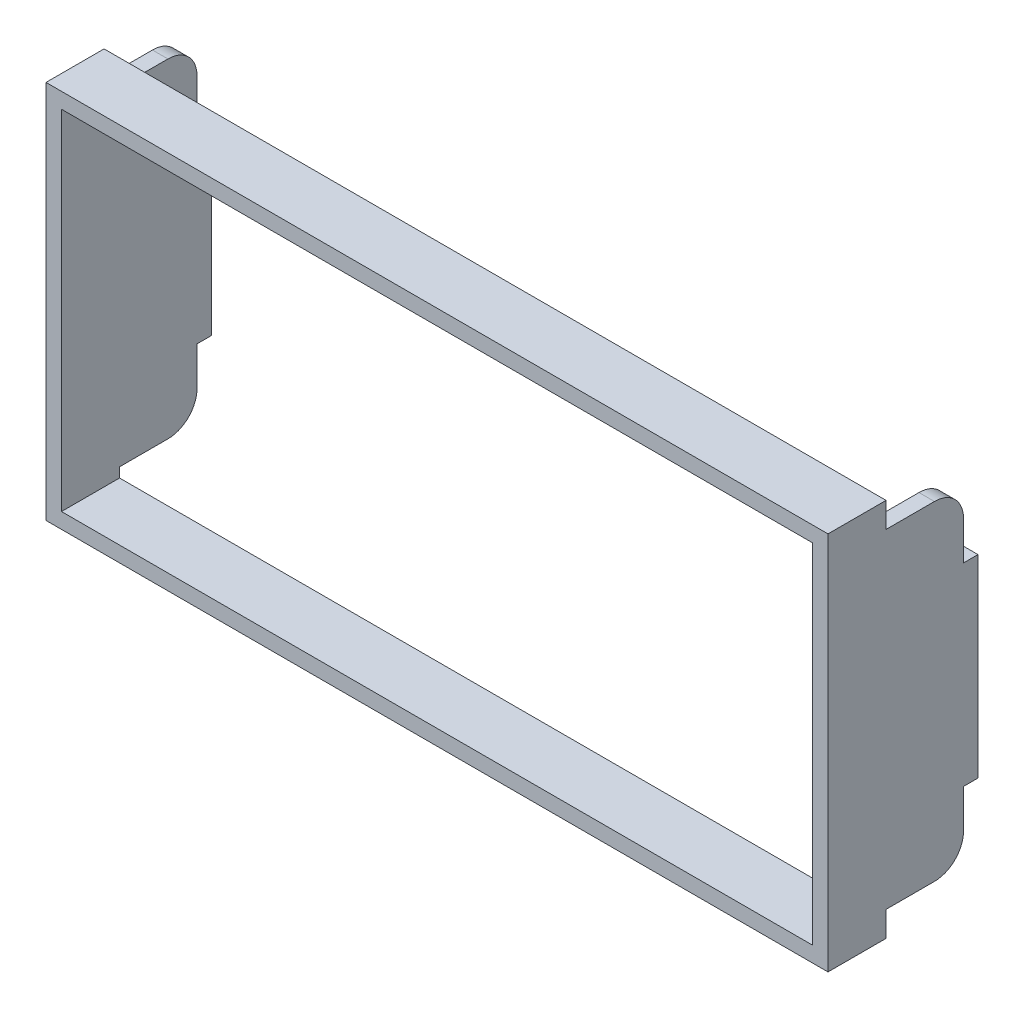
ISO-10303-21;
HEADER;
FILE_DESCRIPTION(('STEP AP214'),'2;1');
FILE_NAME('part.step','',(''),(''),'','','');
FILE_SCHEMA(('AUTOMOTIVE_DESIGN { 1 0 10303 214 1 1 1 1 }'));
ENDSEC;
DATA;
#1=APPLICATION_CONTEXT('core data for automotive mechanical design processes');
#2=APPLICATION_PROTOCOL_DEFINITION('international standard','automotive_design',2000,#1);
#3=PRODUCT_CONTEXT('',#1,'mechanical');
#4=PRODUCT('Part','Part','',(#3));
#5=PRODUCT_RELATED_PRODUCT_CATEGORY('part','',(#4));
#6=PRODUCT_DEFINITION_FORMATION('','',#4);
#7=PRODUCT_DEFINITION_CONTEXT('part definition',#1,'design');
#8=PRODUCT_DEFINITION('design','',#6,#7);
#9=PRODUCT_DEFINITION_SHAPE('','',#8);
#10=(LENGTH_UNIT() NAMED_UNIT(*) SI_UNIT(.MILLI.,.METRE.));
#11=(NAMED_UNIT(*) PLANE_ANGLE_UNIT() SI_UNIT($,.RADIAN.));
#12=(NAMED_UNIT(*) SI_UNIT($,.STERADIAN.) SOLID_ANGLE_UNIT());
#13=UNCERTAINTY_MEASURE_WITH_UNIT(LENGTH_MEASURE(1.E-05),#10,'distance_accuracy_value','');
#14=(GEOMETRIC_REPRESENTATION_CONTEXT(3) GLOBAL_UNCERTAINTY_ASSIGNED_CONTEXT((#13)) GLOBAL_UNIT_ASSIGNED_CONTEXT((#10,
#11,#12)) REPRESENTATION_CONTEXT('',''));
#15=CARTESIAN_POINT('',(0.,0.,0.));
#16=DIRECTION('',(0.,0.,1.));
#17=DIRECTION('',(1.,0.,0.));
#18=AXIS2_PLACEMENT_3D('',#15,#16,#17);
#19=CARTESIAN_POINT('',(0.,0.,-8.));
#20=DIRECTION('',(0.,0.,-1.));
#21=DIRECTION('',(-1.,0.,0.));
#22=AXIS2_PLACEMENT_3D('',#19,#20,#21);
#23=PLANE('',#22);
#24=DIRECTION('',(0.,1.,0.));
#25=VECTOR('',#24,1.);
#26=CARTESIAN_POINT('',(-1.6,-36.,-8.));
#27=LINE('',#26,#25);
#28=CARTESIAN_POINT('',(-1.59999999999999,-7.99999999999999,-8.));
#29=VERTEX_POINT('',#28);
#30=CARTESIAN_POINT('',(-1.59999999999999,-3.99999999999999,-8.));
#31=VERTEX_POINT('',#30);
#32=EDGE_CURVE('E257',#29,#31,#27,.T.);
#33=ORIENTED_EDGE('',*,*,#32,.T.);
#34=DIRECTION('',(1.,0.,0.));
#35=VECTOR('',#34,1.);
#36=CARTESIAN_POINT('',(0.,-4.,-8.));
#37=LINE('',#36,#35);
#38=CARTESIAN_POINT('',(0.,-4.,-8.));
#39=VERTEX_POINT('',#38);
#40=EDGE_CURVE('E446',#31,#39,#37,.T.);
#41=ORIENTED_EDGE('',*,*,#40,.T.);
#42=DIRECTION('',(0.,-1.,0.));
#43=VECTOR('',#42,1.);
#44=CARTESIAN_POINT('',(0.,0.,-8.));
#45=LINE('',#44,#43);
#46=CARTESIAN_POINT('',(0.,-7.99999999999999,-8.));
#47=VERTEX_POINT('',#46);
#48=EDGE_CURVE('E304',#39,#47,#45,.T.);
#49=ORIENTED_EDGE('',*,*,#48,.T.);
#50=DIRECTION('',(1.,0.,0.));
#51=VECTOR('',#50,1.);
#52=CARTESIAN_POINT('',(-1.6,-7.99999999999999,-8.));
#53=LINE('',#52,#51);
#54=EDGE_CURVE('E273',#29,#47,#53,.T.);
#55=ORIENTED_EDGE('',*,*,#54,.F.);
#56=EDGE_LOOP('',(#33,#41,#49,#55));
#57=FACE_BOUND('',#56,.T.);
#58=ADVANCED_FACE('F37',(#57),#23,.T.);
#59=CARTESIAN_POINT('',(0.,0.,-8.));
#60=DIRECTION('',(0.,0.,1.));
#61=DIRECTION('',(1.,0.,0.));
#62=AXIS2_PLACEMENT_3D('',#59,#60,#61);
#63=PLANE('',#62);
#64=DIRECTION('',(0.,-1.,0.));
#65=VECTOR('',#64,1.);
#66=CARTESIAN_POINT('',(79.2,-36.,-8.));
#67=LINE('',#66,#65);
#68=CARTESIAN_POINT('',(79.2,-28.,-8.));
#69=VERTEX_POINT('',#68);
#70=CARTESIAN_POINT('',(79.2,-32.,-8.));
#71=VERTEX_POINT('',#70);
#72=EDGE_CURVE('E309',#69,#71,#67,.T.);
#73=ORIENTED_EDGE('',*,*,#72,.T.);
#74=DIRECTION('',(-1.,0.,0.));
#75=VECTOR('',#74,1.);
#76=CARTESIAN_POINT('',(0.,-32.,-8.));
#77=LINE('',#76,#75);
#78=CARTESIAN_POINT('',(77.6,-32.,-8.));
#79=VERTEX_POINT('',#78);
#80=EDGE_CURVE('E478',#71,#79,#77,.T.);
#81=ORIENTED_EDGE('',*,*,#80,.T.);
#82=DIRECTION('',(0.,1.,0.));
#83=VECTOR('',#82,1.);
#84=CARTESIAN_POINT('',(77.6,0.,-8.));
#85=LINE('',#84,#83);
#86=CARTESIAN_POINT('',(77.6,-28.,-8.));
#87=VERTEX_POINT('',#86);
#88=EDGE_CURVE('E307',#79,#87,#85,.T.);
#89=ORIENTED_EDGE('',*,*,#88,.T.);
#90=DIRECTION('',(-1.,0.,0.));
#91=VECTOR('',#90,1.);
#92=CARTESIAN_POINT('',(77.6,-28.,-8.));
#93=LINE('',#92,#91);
#94=EDGE_CURVE('E287',#69,#87,#93,.T.);
#95=ORIENTED_EDGE('',*,*,#94,.F.);
#96=EDGE_LOOP('',(#73,#81,#89,#95));
#97=FACE_BOUND('',#96,.T.);
#98=ADVANCED_FACE('F547',(#97),#63,.F.);
#99=CARTESIAN_POINT('',(77.6,-8.,-8.));
#100=VERTEX_POINT('',#99);
#101=CARTESIAN_POINT('',(77.6,-4.,-8.));
#102=VERTEX_POINT('',#101);
#103=EDGE_CURVE('E310',#100,#102,#85,.T.);
#104=ORIENTED_EDGE('',*,*,#103,.T.);
#105=DIRECTION('',(1.,0.,0.));
#106=VECTOR('',#105,1.);
#107=CARTESIAN_POINT('',(0.,-3.99999999999999,-8.));
#108=LINE('',#107,#106);
#109=CARTESIAN_POINT('',(79.2,-4.,-8.));
#110=VERTEX_POINT('',#109);
#111=EDGE_CURVE('E45',#102,#110,#108,.T.);
#112=ORIENTED_EDGE('',*,*,#111,.T.);
#113=CARTESIAN_POINT('',(79.2,-8.,-8.));
#114=VERTEX_POINT('',#113);
#115=EDGE_CURVE('E311',#110,#114,#67,.T.);
#116=ORIENTED_EDGE('',*,*,#115,.T.);
#117=DIRECTION('',(1.,0.,0.));
#118=VECTOR('',#117,1.);
#119=CARTESIAN_POINT('',(79.2,-8.,-8.));
#120=LINE('',#119,#118);
#121=EDGE_CURVE('E290',#100,#114,#120,.T.);
#122=ORIENTED_EDGE('',*,*,#121,.F.);
#123=EDGE_LOOP('',(#104,#112,#116,#122));
#124=FACE_BOUND('',#123,.T.);
#125=ADVANCED_FACE('F491',(#124),#63,.F.);
#126=CARTESIAN_POINT('',(0.,0.,0.));
#127=DIRECTION('',(0.,0.,1.));
#128=DIRECTION('',(1.,0.,0.));
#129=AXIS2_PLACEMENT_3D('',#126,#127,#128);
#130=PLANE('',#129);
#131=DIRECTION('',(1.,0.,0.));
#132=VECTOR('',#131,1.);
#133=CARTESIAN_POINT('',(0.,-1.,0.));
#134=LINE('',#133,#132);
#135=CARTESIAN_POINT('',(-1.6,-0.99999999999999,0.));
#136=VERTEX_POINT('',#135);
#137=CARTESIAN_POINT('',(0.,-1.,0.));
#138=VERTEX_POINT('',#137);
#139=EDGE_CURVE('E303',#136,#138,#134,.T.);
#140=ORIENTED_EDGE('',*,*,#139,.F.);
#141=DIRECTION('',(0.,-1.,0.));
#142=VECTOR('',#141,1.);
#143=CARTESIAN_POINT('',(-1.6,1.59999999999999,0.));
#144=LINE('',#143,#142);
#145=CARTESIAN_POINT('',(-1.6,1.59999999999999,0.));
#146=VERTEX_POINT('',#145);
#147=EDGE_CURVE('E360',#146,#136,#144,.T.);
#148=ORIENTED_EDGE('',*,*,#147,.F.);
#149=DIRECTION('',(-1.,0.,0.));
#150=VECTOR('',#149,1.);
#151=CARTESIAN_POINT('',(79.2,1.6,0.));
#152=LINE('',#151,#150);
#153=CARTESIAN_POINT('',(79.2,1.6,0.));
#154=VERTEX_POINT('',#153);
#155=EDGE_CURVE('E357',#154,#146,#152,.T.);
#156=ORIENTED_EDGE('',*,*,#155,.F.);
#157=DIRECTION('',(0.,1.,0.));
#158=VECTOR('',#157,1.);
#159=CARTESIAN_POINT('',(79.2,-37.6,0.));
#160=LINE('',#159,#158);
#161=CARTESIAN_POINT('',(79.2,-1.,0.));
#162=VERTEX_POINT('',#161);
#163=EDGE_CURVE('E342',#162,#154,#160,.T.);
#164=ORIENTED_EDGE('',*,*,#163,.F.);
#165=DIRECTION('',(1.,0.,0.));
#166=VECTOR('',#165,1.);
#167=CARTESIAN_POINT('',(0.,-0.999999999999986,0.));
#168=LINE('',#167,#166);
#169=CARTESIAN_POINT('',(77.6,-1.,0.));
#170=VERTEX_POINT('',#169);
#171=EDGE_CURVE('E376',#170,#162,#168,.T.);
#172=ORIENTED_EDGE('',*,*,#171,.F.);
#173=DIRECTION('',(0.,-1.,0.));
#174=VECTOR('',#173,1.);
#175=CARTESIAN_POINT('',(77.6,0.,0.));
#176=LINE('',#175,#174);
#177=CARTESIAN_POINT('',(77.6,0.,0.));
#178=VERTEX_POINT('',#177);
#179=EDGE_CURVE('E375',#178,#170,#176,.T.);
#180=ORIENTED_EDGE('',*,*,#179,.F.);
#181=DIRECTION('',(-1.,0.,0.));
#182=VECTOR('',#181,1.);
#183=CARTESIAN_POINT('',(77.6,0.,0.));
#184=LINE('',#183,#182);
#185=CARTESIAN_POINT('',(0.,0.,0.));
#186=VERTEX_POINT('',#185);
#187=EDGE_CURVE('E325',#178,#186,#184,.T.);
#188=ORIENTED_EDGE('',*,*,#187,.T.);
#189=DIRECTION('',(0.,-1.,0.));
#190=VECTOR('',#189,1.);
#191=CARTESIAN_POINT('',(0.,0.,0.));
#192=LINE('',#191,#190);
#193=EDGE_CURVE('E387',#186,#138,#192,.T.);
#194=ORIENTED_EDGE('',*,*,#193,.T.);
#195=EDGE_LOOP('',(#140,#148,#156,#164,#172,#180,#188,#194));
#196=FACE_BOUND('',#195,.T.);
#197=ADVANCED_FACE('F516',(#196),#130,.F.);
#198=DIRECTION('',(-1.,0.,0.));
#199=VECTOR('',#198,1.);
#200=CARTESIAN_POINT('',(-1.5178830414797E-13,-35.,0.));
#201=LINE('',#200,#199);
#202=CARTESIAN_POINT('',(0.,-35.,0.));
#203=VERTEX_POINT('',#202);
#204=CARTESIAN_POINT('',(-1.6,-35.,0.));
#205=VERTEX_POINT('',#204);
#206=EDGE_CURVE('E390',#203,#205,#201,.T.);
#207=ORIENTED_EDGE('',*,*,#206,.F.);
#208=DIRECTION('',(0.,1.,0.));
#209=VECTOR('',#208,1.);
#210=CARTESIAN_POINT('',(0.,0.,0.));
#211=LINE('',#210,#209);
#212=CARTESIAN_POINT('',(0.,-36.,0.));
#213=VERTEX_POINT('',#212);
#214=EDGE_CURVE('E397',#213,#203,#211,.T.);
#215=ORIENTED_EDGE('',*,*,#214,.F.);
#216=DIRECTION('',(1.,0.,0.));
#217=VECTOR('',#216,1.);
#218=CARTESIAN_POINT('',(0.,-36.,0.));
#219=LINE('',#218,#217);
#220=CARTESIAN_POINT('',(77.6,-36.,0.));
#221=VERTEX_POINT('',#220);
#222=EDGE_CURVE('E317',#213,#221,#219,.T.);
#223=ORIENTED_EDGE('',*,*,#222,.T.);
#224=DIRECTION('',(0.,1.,0.));
#225=VECTOR('',#224,1.);
#226=CARTESIAN_POINT('',(77.6,-36.,0.));
#227=LINE('',#226,#225);
#228=CARTESIAN_POINT('',(77.6,-35.,0.));
#229=VERTEX_POINT('',#228);
#230=EDGE_CURVE('E404',#221,#229,#227,.T.);
#231=ORIENTED_EDGE('',*,*,#230,.T.);
#232=DIRECTION('',(-1.,0.,0.));
#233=VECTOR('',#232,1.);
#234=CARTESIAN_POINT('',(0.,-35.,0.));
#235=LINE('',#234,#233);
#236=CARTESIAN_POINT('',(79.2,-35.,0.));
#237=VERTEX_POINT('',#236);
#238=EDGE_CURVE('E379',#237,#229,#235,.T.);
#239=ORIENTED_EDGE('',*,*,#238,.F.);
#240=CARTESIAN_POINT('',(79.2,-37.6,0.));
#241=VERTEX_POINT('',#240);
#242=EDGE_CURVE('E354',#241,#237,#160,.T.);
#243=ORIENTED_EDGE('',*,*,#242,.F.);
#244=DIRECTION('',(1.,0.,0.));
#245=VECTOR('',#244,1.);
#246=CARTESIAN_POINT('',(-1.6,-37.6,0.));
#247=LINE('',#246,#245);
#248=CARTESIAN_POINT('',(-1.6,-37.6,0.));
#249=VERTEX_POINT('',#248);
#250=EDGE_CURVE('E347',#249,#241,#247,.T.);
#251=ORIENTED_EDGE('',*,*,#250,.F.);
#252=EDGE_CURVE('E359',#205,#249,#144,.T.);
#253=ORIENTED_EDGE('',*,*,#252,.F.);
#254=EDGE_LOOP('',(#207,#215,#223,#231,#239,#243,#251,#253));
#255=FACE_BOUND('',#254,.T.);
#256=ADVANCED_FACE('F536',(#255),#130,.F.);
#257=CARTESIAN_POINT('',(0.,0.,6.));
#258=DIRECTION('',(0.,0.,1.));
#259=DIRECTION('',(1.,0.,0.));
#260=AXIS2_PLACEMENT_3D('',#257,#258,#259);
#261=PLANE('',#260);
#262=DIRECTION('',(0.,1.,0.));
#263=VECTOR('',#262,1.);
#264=CARTESIAN_POINT('',(79.2,-37.6,6.));
#265=LINE('',#264,#263);
#266=CARTESIAN_POINT('',(79.2,-37.6,6.));
#267=VERTEX_POINT('',#266);
#268=CARTESIAN_POINT('',(79.2,1.6,6.));
#269=VERTEX_POINT('',#268);
#270=EDGE_CURVE('E343',#267,#269,#265,.T.);
#271=ORIENTED_EDGE('',*,*,#270,.T.);
#272=DIRECTION('',(-1.,0.,0.));
#273=VECTOR('',#272,1.);
#274=CARTESIAN_POINT('',(79.2,1.6,6.));
#275=LINE('',#274,#273);
#276=CARTESIAN_POINT('',(-1.6,1.59999999999999,6.));
#277=VERTEX_POINT('',#276);
#278=EDGE_CURVE('E346',#269,#277,#275,.T.);
#279=ORIENTED_EDGE('',*,*,#278,.T.);
#280=DIRECTION('',(0.,-1.,0.));
#281=VECTOR('',#280,1.);
#282=CARTESIAN_POINT('',(-1.6,1.59999999999999,6.));
#283=LINE('',#282,#281);
#284=CARTESIAN_POINT('',(-1.6,-37.6,6.));
#285=VERTEX_POINT('',#284);
#286=EDGE_CURVE('E349',#277,#285,#283,.T.);
#287=ORIENTED_EDGE('',*,*,#286,.T.);
#288=DIRECTION('',(1.,0.,0.));
#289=VECTOR('',#288,1.);
#290=CARTESIAN_POINT('',(-1.6,-37.6,6.));
#291=LINE('',#290,#289);
#292=EDGE_CURVE('E351',#285,#267,#291,.T.);
#293=ORIENTED_EDGE('',*,*,#292,.T.);
#294=EDGE_LOOP('',(#271,#279,#287,#293));
#295=FACE_BOUND('',#294,.T.);
#296=DIRECTION('',(0.,-1.,0.));
#297=VECTOR('',#296,1.);
#298=CARTESIAN_POINT('',(0.,0.,6.));
#299=LINE('',#298,#297);
#300=CARTESIAN_POINT('',(0.,0.,6.));
#301=VERTEX_POINT('',#300);
#302=CARTESIAN_POINT('',(0.,-36.,6.));
#303=VERTEX_POINT('',#302);
#304=EDGE_CURVE('E316',#301,#303,#299,.T.);
#305=ORIENTED_EDGE('',*,*,#304,.F.);
#306=DIRECTION('',(-1.,0.,0.));
#307=VECTOR('',#306,1.);
#308=CARTESIAN_POINT('',(77.6,0.,6.));
#309=LINE('',#308,#307);
#310=CARTESIAN_POINT('',(77.6,0.,6.));
#311=VERTEX_POINT('',#310);
#312=EDGE_CURVE('E314',#311,#301,#309,.T.);
#313=ORIENTED_EDGE('',*,*,#312,.F.);
#314=DIRECTION('',(0.,1.,0.));
#315=VECTOR('',#314,1.);
#316=CARTESIAN_POINT('',(77.6,-36.,6.));
#317=LINE('',#316,#315);
#318=CARTESIAN_POINT('',(77.6,-36.,6.));
#319=VERTEX_POINT('',#318);
#320=EDGE_CURVE('E322',#319,#311,#317,.T.);
#321=ORIENTED_EDGE('',*,*,#320,.F.);
#322=DIRECTION('',(1.,0.,0.));
#323=VECTOR('',#322,1.);
#324=CARTESIAN_POINT('',(0.,-36.,6.));
#325=LINE('',#324,#323);
#326=EDGE_CURVE('E319',#303,#319,#325,.T.);
#327=ORIENTED_EDGE('',*,*,#326,.F.);
#328=EDGE_LOOP('',(#305,#313,#321,#327));
#329=FACE_BOUND('',#328,.T.);
#330=ADVANCED_FACE('F525',(#295,#329),#261,.T.);
#331=CARTESIAN_POINT('',(79.2,-37.6,6.));
#332=DIRECTION('',(-1.,0.,0.));
#333=DIRECTION('',(0.,0.,1.));
#334=AXIS2_PLACEMENT_3D('',#331,#332,#333);
#335=PLANE('',#334);
#336=DIRECTION('',(0.,0.,1.));
#337=VECTOR('',#336,1.);
#338=CARTESIAN_POINT('',(79.2,-35.,-8.));
#339=LINE('',#338,#337);
#340=CARTESIAN_POINT('',(79.2,-35.,-5.));
#341=VERTEX_POINT('',#340);
#342=EDGE_CURVE('E384',#341,#237,#339,.T.);
#343=ORIENTED_EDGE('',*,*,#342,.F.);
#344=CARTESIAN_POINT('',(79.2,-32.,-5.));
#345=DIRECTION('',(-1.,0.,0.));
#346=DIRECTION('',(0.,0.,1.));
#347=AXIS2_PLACEMENT_3D('',#344,#345,#346);
#348=CIRCLE('',#347,3.);
#349=EDGE_CURVE('E488',#341,#71,#348,.F.);
#350=ORIENTED_EDGE('',*,*,#349,.T.);
#351=ORIENTED_EDGE('',*,*,#72,.F.);
#352=DIRECTION('',(0.,0.,1.));
#353=VECTOR('',#352,1.);
#354=CARTESIAN_POINT('',(79.2,-28.,-10.));
#355=LINE('',#354,#353);
#356=CARTESIAN_POINT('',(79.2,-28.,-9.5));
#357=VERTEX_POINT('',#356);
#358=EDGE_CURVE('E293',#357,#69,#355,.T.);
#359=ORIENTED_EDGE('',*,*,#358,.F.);
#360=DIRECTION('',(0.,1.,0.));
#361=VECTOR('',#360,1.);
#362=CARTESIAN_POINT('',(79.2,-37.6,-9.5));
#363=LINE('',#362,#361);
#364=CARTESIAN_POINT('',(79.2,-8.,-9.5));
#365=VERTEX_POINT('',#364);
#366=EDGE_CURVE('E437',#357,#365,#363,.T.);
#367=ORIENTED_EDGE('',*,*,#366,.T.);
#368=DIRECTION('',(0.,0.,1.));
#369=VECTOR('',#368,1.);
#370=CARTESIAN_POINT('',(79.2,-8.,-10.));
#371=LINE('',#370,#369);
#372=EDGE_CURVE('E295',#365,#114,#371,.T.);
#373=ORIENTED_EDGE('',*,*,#372,.T.);
#374=ORIENTED_EDGE('',*,*,#115,.F.);
#375=CARTESIAN_POINT('',(79.2,-4.,-5.));
#376=DIRECTION('',(-1.,0.,0.));
#377=DIRECTION('',(0.,0.,1.));
#378=AXIS2_PLACEMENT_3D('',#375,#376,#377);
#379=CIRCLE('',#378,3.);
#380=CARTESIAN_POINT('',(79.2,-1.,-5.));
#381=VERTEX_POINT('',#380);
#382=EDGE_CURVE('E52',#110,#381,#379,.F.);
#383=ORIENTED_EDGE('',*,*,#382,.T.);
#384=DIRECTION('',(0.,0.,1.));
#385=VECTOR('',#384,1.);
#386=CARTESIAN_POINT('',(79.2,-1.,6.));
#387=LINE('',#386,#385);
#388=EDGE_CURVE('E382',#381,#162,#387,.T.);
#389=ORIENTED_EDGE('',*,*,#388,.T.);
#390=ORIENTED_EDGE('',*,*,#163,.T.);
#391=DIRECTION('',(0.,0.,-1.));
#392=VECTOR('',#391,1.);
#393=CARTESIAN_POINT('',(79.2,1.6,6.));
#394=LINE('',#393,#392);
#395=EDGE_CURVE('E372',#269,#154,#394,.T.);
#396=ORIENTED_EDGE('',*,*,#395,.F.);
#397=ORIENTED_EDGE('',*,*,#270,.F.);
#398=DIRECTION('',(0.,0.,-1.));
#399=VECTOR('',#398,1.);
#400=CARTESIAN_POINT('',(79.2,-37.6,6.));
#401=LINE('',#400,#399);
#402=EDGE_CURVE('E353',#267,#241,#401,.T.);
#403=ORIENTED_EDGE('',*,*,#402,.T.);
#404=ORIENTED_EDGE('',*,*,#242,.T.);
#405=EDGE_LOOP('',(#343,#350,#351,#359,#367,#373,#374,#383,#389,#390,#396,#397,#403,#404));
#406=FACE_BOUND('',#405,.T.);
#407=ADVANCED_FACE('F496',(#406),#335,.F.);
#408=CARTESIAN_POINT('',(79.2,1.6,6.));
#409=DIRECTION('',(0.,-1.,0.));
#410=DIRECTION('',(1.,0.,0.));
#411=AXIS2_PLACEMENT_3D('',#408,#409,#410);
#412=PLANE('',#411);
#413=ORIENTED_EDGE('',*,*,#155,.T.);
#414=DIRECTION('',(0.,0.,-1.));
#415=VECTOR('',#414,1.);
#416=CARTESIAN_POINT('',(-1.6,1.59999999999999,6.));
#417=LINE('',#416,#415);
#418=EDGE_CURVE('E369',#277,#146,#417,.T.);
#419=ORIENTED_EDGE('',*,*,#418,.F.);
#420=ORIENTED_EDGE('',*,*,#278,.F.);
#421=ORIENTED_EDGE('',*,*,#395,.T.);
#422=EDGE_LOOP('',(#413,#419,#420,#421));
#423=FACE_BOUND('',#422,.T.);
#424=ADVANCED_FACE('F520',(#423),#412,.F.);
#425=CARTESIAN_POINT('',(-1.6,1.59999999999999,6.));
#426=DIRECTION('',(1.,0.,0.));
#427=DIRECTION('',(0.,1.,0.));
#428=AXIS2_PLACEMENT_3D('',#425,#426,#427);
#429=PLANE('',#428);
#430=DIRECTION('',(0.,0.,1.));
#431=VECTOR('',#430,1.);
#432=CARTESIAN_POINT('',(-1.6,-0.99999999999999,-8.));
#433=LINE('',#432,#431);
#434=CARTESIAN_POINT('',(-1.6,-0.99999999999999,-5.));
#435=VERTEX_POINT('',#434);
#436=EDGE_CURVE('E256',#435,#136,#433,.T.);
#437=ORIENTED_EDGE('',*,*,#436,.F.);
#438=CARTESIAN_POINT('',(-1.6,-3.99999999999999,-5.));
#439=DIRECTION('',(1.,0.,0.));
#440=DIRECTION('',(0.,1.,0.));
#441=AXIS2_PLACEMENT_3D('',#438,#439,#440);
#442=CIRCLE('',#441,3.);
#443=EDGE_CURVE('E473',#435,#31,#442,.F.);
#444=ORIENTED_EDGE('',*,*,#443,.T.);
#445=ORIENTED_EDGE('',*,*,#32,.F.);
#446=DIRECTION('',(0.,0.,1.));
#447=VECTOR('',#446,1.);
#448=CARTESIAN_POINT('',(-1.6,-7.99999999999999,-10.));
#449=LINE('',#448,#447);
#450=CARTESIAN_POINT('',(-1.6,-7.99999999999999,-9.49999999999999));
#451=VERTEX_POINT('',#450);
#452=EDGE_CURVE('E269',#451,#29,#449,.T.);
#453=ORIENTED_EDGE('',*,*,#452,.F.);
#454=DIRECTION('',(0.,-1.,0.));
#455=VECTOR('',#454,1.);
#456=CARTESIAN_POINT('',(-1.6,-27.9999999999999,-9.49999999999999));
#457=LINE('',#456,#455);
#458=CARTESIAN_POINT('',(-1.60000000000001,-27.9999999999999,-9.49999999999999));
#459=VERTEX_POINT('',#458);
#460=EDGE_CURVE('E265',#451,#459,#457,.T.);
#461=ORIENTED_EDGE('',*,*,#460,.T.);
#462=DIRECTION('',(0.,0.,1.));
#463=VECTOR('',#462,1.);
#464=CARTESIAN_POINT('',(-1.60000000000001,-27.9999999999999,-10.));
#465=LINE('',#464,#463);
#466=CARTESIAN_POINT('',(-1.60000000000001,-27.9999999999999,-8.));
#467=VERTEX_POINT('',#466);
#468=EDGE_CURVE('E260',#459,#467,#465,.T.);
#469=ORIENTED_EDGE('',*,*,#468,.T.);
#470=CARTESIAN_POINT('',(-1.6,-32.,-8.));
#471=VERTEX_POINT('',#470);
#472=EDGE_CURVE('E246',#471,#467,#27,.T.);
#473=ORIENTED_EDGE('',*,*,#472,.F.);
#474=CARTESIAN_POINT('',(-1.6,-32.,-5.));
#475=DIRECTION('',(1.,0.,0.));
#476=DIRECTION('',(0.,1.,0.));
#477=AXIS2_PLACEMENT_3D('',#474,#475,#476);
#478=CIRCLE('',#477,3.);
#479=CARTESIAN_POINT('',(-1.6,-35.,-5.));
#480=VERTEX_POINT('',#479);
#481=EDGE_CURVE('E471',#471,#480,#478,.F.);
#482=ORIENTED_EDGE('',*,*,#481,.T.);
#483=DIRECTION('',(0.,0.,1.));
#484=VECTOR('',#483,1.);
#485=CARTESIAN_POINT('',(-1.6,-35.,6.));
#486=LINE('',#485,#484);
#487=EDGE_CURVE('E392',#480,#205,#486,.T.);
#488=ORIENTED_EDGE('',*,*,#487,.T.);
#489=ORIENTED_EDGE('',*,*,#252,.T.);
#490=DIRECTION('',(0.,0.,-1.));
#491=VECTOR('',#490,1.);
#492=CARTESIAN_POINT('',(-1.6,-37.6,6.));
#493=LINE('',#492,#491);
#494=EDGE_CURVE('E366',#285,#249,#493,.T.);
#495=ORIENTED_EDGE('',*,*,#494,.F.);
#496=ORIENTED_EDGE('',*,*,#286,.F.);
#497=ORIENTED_EDGE('',*,*,#418,.T.);
#498=ORIENTED_EDGE('',*,*,#147,.T.);
#499=EDGE_LOOP('',(#437,#444,#445,#453,#461,#469,#473,#482,#488,#489,#495,#496,#497,#498));
#500=FACE_BOUND('',#499,.T.);
#501=ADVANCED_FACE('F262',(#500),#429,.F.);
#502=CARTESIAN_POINT('',(-1.6,-37.6,6.));
#503=DIRECTION('',(0.,1.,0.));
#504=DIRECTION('',(0.,0.,1.));
#505=AXIS2_PLACEMENT_3D('',#502,#503,#504);
#506=PLANE('',#505);
#507=ORIENTED_EDGE('',*,*,#250,.T.);
#508=ORIENTED_EDGE('',*,*,#402,.F.);
#509=ORIENTED_EDGE('',*,*,#292,.F.);
#510=ORIENTED_EDGE('',*,*,#494,.T.);
#511=EDGE_LOOP('',(#507,#508,#509,#510));
#512=FACE_BOUND('',#511,.T.);
#513=ADVANCED_FACE('F531',(#512),#506,.F.);
#514=CARTESIAN_POINT('',(77.6,0.,6.));
#515=DIRECTION('',(0.,-1.,0.));
#516=DIRECTION('',(1.,0.,0.));
#517=AXIS2_PLACEMENT_3D('',#514,#515,#516);
#518=PLANE('',#517);
#519=ORIENTED_EDGE('',*,*,#187,.F.);
#520=DIRECTION('',(0.,0.,-1.));
#521=VECTOR('',#520,1.);
#522=CARTESIAN_POINT('',(77.6,0.,6.));
#523=LINE('',#522,#521);
#524=EDGE_CURVE('E324',#311,#178,#523,.T.);
#525=ORIENTED_EDGE('',*,*,#524,.F.);
#526=ORIENTED_EDGE('',*,*,#312,.T.);
#527=DIRECTION('',(0.,0.,-1.));
#528=VECTOR('',#527,1.);
#529=CARTESIAN_POINT('',(0.,0.,6.));
#530=LINE('',#529,#528);
#531=EDGE_CURVE('E339',#301,#186,#530,.T.);
#532=ORIENTED_EDGE('',*,*,#531,.T.);
#533=EDGE_LOOP('',(#519,#525,#526,#532));
#534=FACE_BOUND('',#533,.T.);
#535=ADVANCED_FACE('F769',(#534),#518,.T.);
#536=CARTESIAN_POINT('',(0.,0.,6.));
#537=DIRECTION('',(1.,0.,0.));
#538=DIRECTION('',(0.,0.,-1.));
#539=AXIS2_PLACEMENT_3D('',#536,#537,#538);
#540=PLANE('',#539);
#541=ORIENTED_EDGE('',*,*,#48,.F.);
#542=CARTESIAN_POINT('',(0.,-4.,-5.));
#543=DIRECTION('',(1.,0.,0.));
#544=DIRECTION('',(0.,0.,-1.));
#545=AXIS2_PLACEMENT_3D('',#542,#543,#544);
#546=CIRCLE('',#545,3.);
#547=CARTESIAN_POINT('',(0.,-1.,-5.));
#548=VERTEX_POINT('',#547);
#549=EDGE_CURVE('E467',#39,#548,#546,.T.);
#550=ORIENTED_EDGE('',*,*,#549,.T.);
#551=DIRECTION('',(0.,0.,1.));
#552=VECTOR('',#551,1.);
#553=CARTESIAN_POINT('',(0.,-1.,-8.));
#554=LINE('',#553,#552);
#555=EDGE_CURVE('E380',#548,#138,#554,.T.);
#556=ORIENTED_EDGE('',*,*,#555,.T.);
#557=ORIENTED_EDGE('',*,*,#193,.F.);
#558=ORIENTED_EDGE('',*,*,#531,.F.);
#559=ORIENTED_EDGE('',*,*,#304,.T.);
#560=DIRECTION('',(0.,0.,-1.));
#561=VECTOR('',#560,1.);
#562=CARTESIAN_POINT('',(0.,-36.,6.));
#563=LINE('',#562,#561);
#564=EDGE_CURVE('E336',#303,#213,#563,.T.);
#565=ORIENTED_EDGE('',*,*,#564,.T.);
#566=ORIENTED_EDGE('',*,*,#214,.T.);
#567=DIRECTION('',(0.,0.,1.));
#568=VECTOR('',#567,1.);
#569=CARTESIAN_POINT('',(0.,-35.,6.));
#570=LINE('',#569,#568);
#571=CARTESIAN_POINT('',(0.,-35.,-5.));
#572=VERTEX_POINT('',#571);
#573=EDGE_CURVE('E394',#572,#203,#570,.T.);
#574=ORIENTED_EDGE('',*,*,#573,.F.);
#575=CARTESIAN_POINT('',(0.,-32.,-5.));
#576=DIRECTION('',(1.,0.,0.));
#577=DIRECTION('',(0.,0.,-1.));
#578=AXIS2_PLACEMENT_3D('',#575,#576,#577);
#579=CIRCLE('',#578,3.);
#580=CARTESIAN_POINT('',(0.,-32.,-8.));
#581=VERTEX_POINT('',#580);
#582=EDGE_CURVE('E465',#572,#581,#579,.T.);
#583=ORIENTED_EDGE('',*,*,#582,.T.);
#584=CARTESIAN_POINT('',(0.,-28.,-8.));
#585=VERTEX_POINT('',#584);
#586=EDGE_CURVE('E305',#585,#581,#45,.T.);
#587=ORIENTED_EDGE('',*,*,#586,.F.);
#588=DIRECTION('',(0.,0.,1.));
#589=VECTOR('',#588,1.);
#590=CARTESIAN_POINT('',(0.,-28.,-10.));
#591=LINE('',#590,#589);
#592=CARTESIAN_POINT('',(0.,-28.,-9.49999999999999));
#593=VERTEX_POINT('',#592);
#594=EDGE_CURVE('E268',#593,#585,#591,.T.);
#595=ORIENTED_EDGE('',*,*,#594,.F.);
#596=DIRECTION('',(0.,1.,0.));
#597=VECTOR('',#596,1.);
#598=CARTESIAN_POINT('',(0.,0.,-9.49999999999999));
#599=LINE('',#598,#597);
#600=CARTESIAN_POINT('',(0.,-7.99999999999999,-9.49999999999999));
#601=VERTEX_POINT('',#600);
#602=EDGE_CURVE('E426',#593,#601,#599,.T.);
#603=ORIENTED_EDGE('',*,*,#602,.T.);
#604=DIRECTION('',(0.,0.,1.));
#605=VECTOR('',#604,1.);
#606=CARTESIAN_POINT('',(0.,-7.99999999999999,-10.));
#607=LINE('',#606,#605);
#608=EDGE_CURVE('E277',#601,#47,#607,.T.);
#609=ORIENTED_EDGE('',*,*,#608,.T.);
#610=EDGE_LOOP('',(#541,#550,#556,#557,#558,#559,#565,#566,#574,#583,#587,#595,#603,#609));
#611=FACE_BOUND('',#610,.T.);
#612=ADVANCED_FACE('F764',(#611),#540,.T.);
#613=CARTESIAN_POINT('',(0.,-36.,6.));
#614=DIRECTION('',(0.,1.,0.));
#615=DIRECTION('',(0.,0.,1.));
#616=AXIS2_PLACEMENT_3D('',#613,#614,#615);
#617=PLANE('',#616);
#618=ORIENTED_EDGE('',*,*,#222,.F.);
#619=ORIENTED_EDGE('',*,*,#564,.F.);
#620=ORIENTED_EDGE('',*,*,#326,.T.);
#621=DIRECTION('',(0.,0.,-1.));
#622=VECTOR('',#621,1.);
#623=CARTESIAN_POINT('',(77.6,-36.,6.));
#624=LINE('',#623,#622);
#625=EDGE_CURVE('E333',#319,#221,#624,.T.);
#626=ORIENTED_EDGE('',*,*,#625,.T.);
#627=EDGE_LOOP('',(#618,#619,#620,#626));
#628=FACE_BOUND('',#627,.T.);
#629=ADVANCED_FACE('F754',(#628),#617,.T.);
#630=CARTESIAN_POINT('',(77.6,-36.,6.));
#631=DIRECTION('',(-1.,0.,0.));
#632=DIRECTION('',(0.,0.,1.));
#633=AXIS2_PLACEMENT_3D('',#630,#631,#632);
#634=PLANE('',#633);
#635=ORIENTED_EDGE('',*,*,#88,.F.);
#636=CARTESIAN_POINT('',(77.6,-32.,-5.));
#637=DIRECTION('',(-1.,0.,0.));
#638=DIRECTION('',(0.,0.,1.));
#639=AXIS2_PLACEMENT_3D('',#636,#637,#638);
#640=CIRCLE('',#639,3.);
#641=CARTESIAN_POINT('',(77.6,-35.,-5.));
#642=VERTEX_POINT('',#641);
#643=EDGE_CURVE('E483',#79,#642,#640,.T.);
#644=ORIENTED_EDGE('',*,*,#643,.T.);
#645=DIRECTION('',(0.,0.,1.));
#646=VECTOR('',#645,1.);
#647=CARTESIAN_POINT('',(77.6,-35.,-8.));
#648=LINE('',#647,#646);
#649=EDGE_CURVE('E313',#642,#229,#648,.T.);
#650=ORIENTED_EDGE('',*,*,#649,.T.);
#651=ORIENTED_EDGE('',*,*,#230,.F.);
#652=ORIENTED_EDGE('',*,*,#625,.F.);
#653=ORIENTED_EDGE('',*,*,#320,.T.);
#654=ORIENTED_EDGE('',*,*,#524,.T.);
#655=ORIENTED_EDGE('',*,*,#179,.T.);
#656=DIRECTION('',(0.,0.,1.));
#657=VECTOR('',#656,1.);
#658=CARTESIAN_POINT('',(77.6,-1.,6.));
#659=LINE('',#658,#657);
#660=CARTESIAN_POINT('',(77.6,-1.,-5.));
#661=VERTEX_POINT('',#660);
#662=EDGE_CURVE('E328',#661,#170,#659,.T.);
#663=ORIENTED_EDGE('',*,*,#662,.F.);
#664=CARTESIAN_POINT('',(77.6,-4.,-5.));
#665=DIRECTION('',(-1.,0.,0.));
#666=DIRECTION('',(0.,0.,1.));
#667=AXIS2_PLACEMENT_3D('',#664,#665,#666);
#668=CIRCLE('',#667,3.);
#669=EDGE_CURVE('E481',#661,#102,#668,.T.);
#670=ORIENTED_EDGE('',*,*,#669,.T.);
#671=ORIENTED_EDGE('',*,*,#103,.F.);
#672=DIRECTION('',(0.,0.,1.));
#673=VECTOR('',#672,1.);
#674=CARTESIAN_POINT('',(77.6,-8.,-10.));
#675=LINE('',#674,#673);
#676=CARTESIAN_POINT('',(77.6,-8.,-9.5));
#677=VERTEX_POINT('',#676);
#678=EDGE_CURVE('E298',#677,#100,#675,.T.);
#679=ORIENTED_EDGE('',*,*,#678,.F.);
#680=DIRECTION('',(0.,-1.,0.));
#681=VECTOR('',#680,1.);
#682=CARTESIAN_POINT('',(77.6,-28.,-9.5));
#683=LINE('',#682,#681);
#684=CARTESIAN_POINT('',(77.6,-28.,-9.5));
#685=VERTEX_POINT('',#684);
#686=EDGE_CURVE('E442',#677,#685,#683,.T.);
#687=ORIENTED_EDGE('',*,*,#686,.T.);
#688=DIRECTION('',(0.,0.,1.));
#689=VECTOR('',#688,1.);
#690=CARTESIAN_POINT('',(77.6,-28.,-10.));
#691=LINE('',#690,#689);
#692=EDGE_CURVE('E300',#685,#87,#691,.T.);
#693=ORIENTED_EDGE('',*,*,#692,.T.);
#694=EDGE_LOOP('',(#635,#644,#650,#651,#652,#653,#654,#655,#663,#670,#671,#679,#687,#693));
#695=FACE_BOUND('',#694,.T.);
#696=ADVANCED_FACE('F505',(#695),#634,.T.);
#697=CARTESIAN_POINT('',(77.6,-1.,-8.));
#698=DIRECTION('',(0.,-1.,0.));
#699=DIRECTION('',(1.,0.,0.));
#700=AXIS2_PLACEMENT_3D('',#697,#698,#699);
#701=PLANE('',#700);
#702=ORIENTED_EDGE('',*,*,#388,.F.);
#703=DIRECTION('',(1.,0.,0.));
#704=VECTOR('',#703,1.);
#705=CARTESIAN_POINT('',(77.6,-1.,-5.));
#706=LINE('',#705,#704);
#707=EDGE_CURVE('E12',#381,#661,#706,.F.);
#708=ORIENTED_EDGE('',*,*,#707,.T.);
#709=ORIENTED_EDGE('',*,*,#662,.T.);
#710=ORIENTED_EDGE('',*,*,#171,.T.);
#711=EDGE_LOOP('',(#702,#708,#709,#710));
#712=FACE_BOUND('',#711,.T.);
#713=ADVANCED_FACE('F509',(#712),#701,.F.);
#714=CARTESIAN_POINT('',(77.6,-35.,-8.));
#715=DIRECTION('',(0.,1.,0.));
#716=DIRECTION('',(0.,0.,1.));
#717=AXIS2_PLACEMENT_3D('',#714,#715,#716);
#718=PLANE('',#717);
#719=ORIENTED_EDGE('',*,*,#649,.F.);
#720=DIRECTION('',(-1.,0.,0.));
#721=VECTOR('',#720,1.);
#722=CARTESIAN_POINT('',(77.6,-35.,-5.));
#723=LINE('',#722,#721);
#724=EDGE_CURVE('E485',#642,#341,#723,.F.);
#725=ORIENTED_EDGE('',*,*,#724,.T.);
#726=ORIENTED_EDGE('',*,*,#342,.T.);
#727=ORIENTED_EDGE('',*,*,#238,.T.);
#728=EDGE_LOOP('',(#719,#725,#726,#727));
#729=FACE_BOUND('',#728,.T.);
#730=ADVANCED_FACE('F606',(#729),#718,.F.);
#731=CARTESIAN_POINT('',(0.,-1.,-8.));
#732=DIRECTION('',(0.,-1.,0.));
#733=DIRECTION('',(1.,0.,0.));
#734=AXIS2_PLACEMENT_3D('',#731,#732,#733);
#735=PLANE('',#734);
#736=ORIENTED_EDGE('',*,*,#555,.F.);
#737=DIRECTION('',(1.,0.,0.));
#738=VECTOR('',#737,1.);
#739=CARTESIAN_POINT('',(-1.59999999999999,-0.99999999999999,-5.));
#740=LINE('',#739,#738);
#741=EDGE_CURVE('E469',#548,#435,#740,.F.);
#742=ORIENTED_EDGE('',*,*,#741,.T.);
#743=ORIENTED_EDGE('',*,*,#436,.T.);
#744=ORIENTED_EDGE('',*,*,#139,.T.);
#745=EDGE_LOOP('',(#736,#742,#743,#744));
#746=FACE_BOUND('',#745,.T.);
#747=ADVANCED_FACE('F600',(#746),#735,.F.);
#748=CARTESIAN_POINT('',(0.,-35.,-8.));
#749=DIRECTION('',(0.,1.,0.));
#750=DIRECTION('',(-1.,0.,0.));
#751=AXIS2_PLACEMENT_3D('',#748,#749,#750);
#752=PLANE('',#751);
#753=ORIENTED_EDGE('',*,*,#487,.F.);
#754=DIRECTION('',(-1.,0.,0.));
#755=VECTOR('',#754,1.);
#756=CARTESIAN_POINT('',(0.,-35.,-5.));
#757=LINE('',#756,#755);
#758=EDGE_CURVE('E476',#480,#572,#757,.F.);
#759=ORIENTED_EDGE('',*,*,#758,.T.);
#760=ORIENTED_EDGE('',*,*,#573,.T.);
#761=ORIENTED_EDGE('',*,*,#206,.T.);
#762=EDGE_LOOP('',(#753,#759,#760,#761));
#763=FACE_BOUND('',#762,.T.);
#764=ADVANCED_FACE('F595',(#763),#752,.F.);
#765=ORIENTED_EDGE('',*,*,#586,.T.);
#766=DIRECTION('',(-1.,0.,0.));
#767=VECTOR('',#766,1.);
#768=CARTESIAN_POINT('',(-1.59999999999999,-32.,-8.));
#769=LINE('',#768,#767);
#770=EDGE_CURVE('E254',#581,#471,#769,.T.);
#771=ORIENTED_EDGE('',*,*,#770,.T.);
#772=ORIENTED_EDGE('',*,*,#472,.T.);
#773=DIRECTION('',(-1.,0.,0.));
#774=VECTOR('',#773,1.);
#775=CARTESIAN_POINT('',(0.,-28.,-8.));
#776=LINE('',#775,#774);
#777=EDGE_CURVE('E251',#585,#467,#776,.T.);
#778=ORIENTED_EDGE('',*,*,#777,.F.);
#779=EDGE_LOOP('',(#765,#771,#772,#778));
#780=FACE_BOUND('',#779,.T.);
#781=ADVANCED_FACE('F249',(#780),#23,.T.);
#782=CARTESIAN_POINT('',(77.6,-28.,-10.));
#783=DIRECTION('',(0.,1.,0.));
#784=DIRECTION('',(0.,0.,1.));
#785=AXIS2_PLACEMENT_3D('',#782,#783,#784);
#786=PLANE('',#785);
#787=ORIENTED_EDGE('',*,*,#692,.F.);
#788=DIRECTION('',(1.,0.,0.));
#789=VECTOR('',#788,1.);
#790=CARTESIAN_POINT('',(77.6,-28.,-9.5));
#791=LINE('',#790,#789);
#792=EDGE_CURVE('E444',#685,#357,#791,.T.);
#793=ORIENTED_EDGE('',*,*,#792,.T.);
#794=ORIENTED_EDGE('',*,*,#358,.T.);
#795=ORIENTED_EDGE('',*,*,#94,.T.);
#796=EDGE_LOOP('',(#787,#793,#794,#795));
#797=FACE_BOUND('',#796,.T.);
#798=ADVANCED_FACE('F553',(#797),#786,.F.);
#799=CARTESIAN_POINT('',(79.2,-8.,-10.));
#800=DIRECTION('',(0.,-1.,0.));
#801=DIRECTION('',(0.,0.,-1.));
#802=AXIS2_PLACEMENT_3D('',#799,#800,#801);
#803=PLANE('',#802);
#804=ORIENTED_EDGE('',*,*,#372,.F.);
#805=DIRECTION('',(-1.,0.,0.));
#806=VECTOR('',#805,1.);
#807=CARTESIAN_POINT('',(79.2,-8.,-9.5));
#808=LINE('',#807,#806);
#809=EDGE_CURVE('E440',#365,#677,#808,.T.);
#810=ORIENTED_EDGE('',*,*,#809,.T.);
#811=ORIENTED_EDGE('',*,*,#678,.T.);
#812=ORIENTED_EDGE('',*,*,#121,.T.);
#813=EDGE_LOOP('',(#804,#810,#811,#812));
#814=FACE_BOUND('',#813,.T.);
#815=ADVANCED_FACE('F501',(#814),#803,.F.);
#816=CARTESIAN_POINT('',(0.,0.,-10.));
#817=DIRECTION('',(0.,0.,1.));
#818=DIRECTION('',(1.,0.,0.));
#819=AXIS2_PLACEMENT_3D('',#816,#817,#818);
#820=PLANE('',#819);
#821=DIRECTION('',(1.,0.,0.));
#822=VECTOR('',#821,1.);
#823=CARTESIAN_POINT('',(0.,-8.5,-10.));
#824=LINE('',#823,#822);
#825=CARTESIAN_POINT('',(78.1,-8.5,-10.));
#826=VERTEX_POINT('',#825);
#827=CARTESIAN_POINT('',(78.7,-8.5,-10.));
#828=VERTEX_POINT('',#827);
#829=EDGE_CURVE('E432',#826,#828,#824,.T.);
#830=ORIENTED_EDGE('',*,*,#829,.T.);
#831=DIRECTION('',(0.,-1.,0.));
#832=VECTOR('',#831,1.);
#833=CARTESIAN_POINT('',(78.7,0.,-10.));
#834=LINE('',#833,#832);
#835=CARTESIAN_POINT('',(78.7,-27.5,-10.));
#836=VERTEX_POINT('',#835);
#837=EDGE_CURVE('E434',#828,#836,#834,.T.);
#838=ORIENTED_EDGE('',*,*,#837,.T.);
#839=DIRECTION('',(-1.,0.,0.));
#840=VECTOR('',#839,1.);
#841=CARTESIAN_POINT('',(0.,-27.5,-10.));
#842=LINE('',#841,#840);
#843=CARTESIAN_POINT('',(78.1,-27.5,-10.));
#844=VERTEX_POINT('',#843);
#845=EDGE_CURVE('E428',#836,#844,#842,.T.);
#846=ORIENTED_EDGE('',*,*,#845,.T.);
#847=DIRECTION('',(0.,1.,0.));
#848=VECTOR('',#847,1.);
#849=CARTESIAN_POINT('',(78.1,-8.,-10.));
#850=LINE('',#849,#848);
#851=EDGE_CURVE('E430',#844,#826,#850,.T.);
#852=ORIENTED_EDGE('',*,*,#851,.T.);
#853=EDGE_LOOP('',(#830,#838,#846,#852));
#854=FACE_BOUND('',#853,.T.);
#855=ADVANCED_FACE('F566',(#854),#820,.F.);
#856=CARTESIAN_POINT('',(0.,-28.,-10.));
#857=DIRECTION('',(0.,1.,0.));
#858=DIRECTION('',(-1.,0.,0.));
#859=AXIS2_PLACEMENT_3D('',#856,#857,#858);
#860=PLANE('',#859);
#861=ORIENTED_EDGE('',*,*,#468,.F.);
#862=DIRECTION('',(1.,0.,0.));
#863=VECTOR('',#862,1.);
#864=CARTESIAN_POINT('',(0.,-28.,-9.49999999999999));
#865=LINE('',#864,#863);
#866=EDGE_CURVE('E424',#459,#593,#865,.T.);
#867=ORIENTED_EDGE('',*,*,#866,.T.);
#868=ORIENTED_EDGE('',*,*,#594,.T.);
#869=ORIENTED_EDGE('',*,*,#777,.T.);
#870=EDGE_LOOP('',(#861,#867,#868,#869));
#871=FACE_BOUND('',#870,.T.);
#872=ADVANCED_FACE('F271',(#871),#860,.F.);
#873=CARTESIAN_POINT('',(-1.6,-7.99999999999999,-10.));
#874=DIRECTION('',(0.,-1.,0.));
#875=DIRECTION('',(1.,0.,0.));
#876=AXIS2_PLACEMENT_3D('',#873,#874,#875);
#877=PLANE('',#876);
#878=ORIENTED_EDGE('',*,*,#608,.F.);
#879=DIRECTION('',(-1.,0.,0.));
#880=VECTOR('',#879,1.);
#881=CARTESIAN_POINT('',(-1.6,-7.99999999999999,-9.49999999999999));
#882=LINE('',#881,#880);
#883=EDGE_CURVE('E420',#601,#451,#882,.T.);
#884=ORIENTED_EDGE('',*,*,#883,.T.);
#885=ORIENTED_EDGE('',*,*,#452,.T.);
#886=ORIENTED_EDGE('',*,*,#54,.T.);
#887=EDGE_LOOP('',(#878,#884,#885,#886));
#888=FACE_BOUND('',#887,.T.);
#889=ADVANCED_FACE('F709',(#888),#877,.F.);
#890=CARTESIAN_POINT('',(0.,0.,-10.));
#891=DIRECTION('',(0.,0.,-1.));
#892=DIRECTION('',(-1.,0.,0.));
#893=AXIS2_PLACEMENT_3D('',#890,#891,#892);
#894=PLANE('',#893);
#895=DIRECTION('',(0.,1.,0.));
#896=VECTOR('',#895,1.);
#897=CARTESIAN_POINT('',(-1.09999999999998,-7.99999999999999,-10.));
#898=LINE('',#897,#896);
#899=CARTESIAN_POINT('',(-1.09999999999998,-27.4999999999999,-10.));
#900=VERTEX_POINT('',#899);
#901=CARTESIAN_POINT('',(-1.09999999999998,-8.5,-10.));
#902=VERTEX_POINT('',#901);
#903=EDGE_CURVE('E415',#900,#902,#898,.T.);
#904=ORIENTED_EDGE('',*,*,#903,.T.);
#905=DIRECTION('',(1.,0.,0.));
#906=VECTOR('',#905,1.);
#907=CARTESIAN_POINT('',(0.,-8.5,-10.));
#908=LINE('',#907,#906);
#909=CARTESIAN_POINT('',(-0.500000000000014,-8.5,-10.));
#910=VERTEX_POINT('',#909);
#911=EDGE_CURVE('E417',#902,#910,#908,.T.);
#912=ORIENTED_EDGE('',*,*,#911,.T.);
#913=DIRECTION('',(0.,-1.,0.));
#914=VECTOR('',#913,1.);
#915=CARTESIAN_POINT('',(-0.500000000000014,0.,-10.));
#916=LINE('',#915,#914);
#917=CARTESIAN_POINT('',(-0.500000000000014,-27.5,-10.));
#918=VERTEX_POINT('',#917);
#919=EDGE_CURVE('E411',#910,#918,#916,.T.);
#920=ORIENTED_EDGE('',*,*,#919,.T.);
#921=DIRECTION('',(-1.,0.,0.));
#922=VECTOR('',#921,1.);
#923=CARTESIAN_POINT('',(-1.6,-27.4999999999999,-10.));
#924=LINE('',#923,#922);
#925=EDGE_CURVE('E413',#918,#900,#924,.T.);
#926=ORIENTED_EDGE('',*,*,#925,.T.);
#927=EDGE_LOOP('',(#904,#912,#920,#926));
#928=FACE_BOUND('',#927,.T.);
#929=ADVANCED_FACE('F623',(#928),#894,.T.);
#930=CARTESIAN_POINT('',(-7.75204553327135E-13,-27.5,-10.));
#931=DIRECTION('',(0.,-0.707106781186548,-0.707106781186548));
#932=DIRECTION('',(1.,0.,0.));
#933=AXIS2_PLACEMENT_3D('',#930,#931,#932);
#934=PLANE('',#933);
#935=DIRECTION('',(0.57735026918962,-0.577350269189637,0.57735026918962));
#936=VECTOR('',#935,1.);
#937=CARTESIAN_POINT('',(-9.66666666666675,-18.333333333333,-19.1666666666667));
#938=LINE('',#937,#936);
#939=EDGE_CURVE('E280',#593,#918,#938,.F.);
#940=ORIENTED_EDGE('',*,*,#939,.F.);
#941=ORIENTED_EDGE('',*,*,#866,.F.);
#942=DIRECTION('',(0.577350269189631,0.577350269189615,-0.577350269189631));
#943=VECTOR('',#942,1.);
#944=CARTESIAN_POINT('',(-0.733333333333584,-27.1333333333335,-10.3666666666664));
#945=LINE('',#944,#943);
#946=EDGE_CURVE('E274',#900,#459,#945,.F.);
#947=ORIENTED_EDGE('',*,*,#946,.F.);
#948=ORIENTED_EDGE('',*,*,#925,.F.);
#949=EDGE_LOOP('',(#940,#941,#947,#948));
#950=FACE_BOUND('',#949,.T.);
#951=ADVANCED_FACE('F619',(#950),#934,.T.);
#952=CARTESIAN_POINT('',(-1.09999999999999,0.,-10.));
#953=DIRECTION('',(-0.707106781186548,0.,-0.707106781186547));
#954=DIRECTION('',(0.,-1.,0.));
#955=AXIS2_PLACEMENT_3D('',#952,#953,#954);
#956=PLANE('',#955);
#957=ORIENTED_EDGE('',*,*,#946,.T.);
#958=ORIENTED_EDGE('',*,*,#460,.F.);
#959=DIRECTION('',(0.577350269189626,-0.577350269189625,-0.577350269189626));
#960=VECTOR('',#959,1.);
#961=CARTESIAN_POINT('',(-3.93333333333332,-5.66666666666668,-7.16666666666667));
#962=LINE('',#961,#960);
#963=EDGE_CURVE('E449',#902,#451,#962,.F.);
#964=ORIENTED_EDGE('',*,*,#963,.F.);
#965=ORIENTED_EDGE('',*,*,#903,.F.);
#966=EDGE_LOOP('',(#957,#958,#964,#965));
#967=FACE_BOUND('',#966,.T.);
#968=ADVANCED_FACE('F615',(#967),#956,.T.);
#969=CARTESIAN_POINT('',(-0.500000000000014,0.,-10.));
#970=DIRECTION('',(-0.707106781186548,0.,0.707106781186548));
#971=DIRECTION('',(0.,-1.,0.));
#972=AXIS2_PLACEMENT_3D('',#969,#970,#971);
#973=PLANE('',#972);
#974=ORIENTED_EDGE('',*,*,#939,.T.);
#975=ORIENTED_EDGE('',*,*,#919,.F.);
#976=DIRECTION('',(-0.577350269189625,-0.577350269189627,-0.577350269189625));
#977=VECTOR('',#976,1.);
#978=CARTESIAN_POINT('',(2.33333333333332,-5.66666666666666,-7.16666666666666));
#979=LINE('',#978,#977);
#980=EDGE_CURVE('E447',#601,#910,#979,.T.);
#981=ORIENTED_EDGE('',*,*,#980,.F.);
#982=ORIENTED_EDGE('',*,*,#602,.F.);
#983=EDGE_LOOP('',(#974,#975,#981,#982));
#984=FACE_BOUND('',#983,.T.);
#985=ADVANCED_FACE('F581',(#984),#973,.F.);
#986=CARTESIAN_POINT('',(0.,-8.5,-10.));
#987=DIRECTION('',(0.,0.707106781186548,-0.707106781186548));
#988=DIRECTION('',(-1.,0.,0.));
#989=AXIS2_PLACEMENT_3D('',#986,#987,#988);
#990=PLANE('',#989);
#991=ORIENTED_EDGE('',*,*,#963,.T.);
#992=ORIENTED_EDGE('',*,*,#883,.F.);
#993=ORIENTED_EDGE('',*,*,#980,.T.);
#994=ORIENTED_EDGE('',*,*,#911,.F.);
#995=EDGE_LOOP('',(#991,#992,#993,#994));
#996=FACE_BOUND('',#995,.T.);
#997=ADVANCED_FACE('F574',(#996),#990,.T.);
#998=CARTESIAN_POINT('',(78.1,0.,-10.));
#999=DIRECTION('',(-0.707106781186547,0.,-0.707106781186547));
#1000=DIRECTION('',(0.,-1.,0.));
#1001=AXIS2_PLACEMENT_3D('',#998,#999,#1000);
#1002=PLANE('',#1001);
#1003=DIRECTION('',(-0.577350269189626,-0.577350269189626,0.577350269189626));
#1004=VECTOR('',#1003,1.);
#1005=CARTESIAN_POINT('',(52.0666666666667,-53.5333333333333,16.0333333333333));
#1006=LINE('',#1005,#1004);
#1007=EDGE_CURVE('E458',#685,#844,#1006,.F.);
#1008=ORIENTED_EDGE('',*,*,#1007,.F.);
#1009=ORIENTED_EDGE('',*,*,#686,.F.);
#1010=DIRECTION('',(-0.577350269189626,0.577350269189626,0.577350269189626));
#1011=VECTOR('',#1010,1.);
#1012=CARTESIAN_POINT('',(75.2666666666667,-5.66666666666667,-7.16666666666667));
#1013=LINE('',#1012,#1011);
#1014=EDGE_CURVE('E450',#826,#677,#1013,.T.);
#1015=ORIENTED_EDGE('',*,*,#1014,.F.);
#1016=ORIENTED_EDGE('',*,*,#851,.F.);
#1017=EDGE_LOOP('',(#1008,#1009,#1015,#1016));
#1018=FACE_BOUND('',#1017,.T.);
#1019=ADVANCED_FACE('F572',(#1018),#1002,.T.);
#1020=CARTESIAN_POINT('',(0.,-8.5,-10.));
#1021=DIRECTION('',(0.,-0.707106781186547,0.707106781186547));
#1022=DIRECTION('',(1.,0.,0.));
#1023=AXIS2_PLACEMENT_3D('',#1020,#1021,#1022);
#1024=PLANE('',#1023);
#1025=ORIENTED_EDGE('',*,*,#1014,.T.);
#1026=ORIENTED_EDGE('',*,*,#809,.F.);
#1027=DIRECTION('',(-0.577350269189626,-0.577350269189626,-0.577350269189626));
#1028=VECTOR('',#1027,1.);
#1029=CARTESIAN_POINT('',(52.4666666666667,-34.7333333333333,-36.2333333333333));
#1030=LINE('',#1029,#1028);
#1031=EDGE_CURVE('E456',#828,#365,#1030,.F.);
#1032=ORIENTED_EDGE('',*,*,#1031,.F.);
#1033=ORIENTED_EDGE('',*,*,#829,.F.);
#1034=EDGE_LOOP('',(#1025,#1026,#1032,#1033));
#1035=FACE_BOUND('',#1034,.T.);
#1036=ADVANCED_FACE('F570',(#1035),#1024,.F.);
#1037=CARTESIAN_POINT('',(0.,-27.5,-10.));
#1038=DIRECTION('',(0.,0.707106781186547,0.707106781186547));
#1039=DIRECTION('',(-1.,0.,0.));
#1040=AXIS2_PLACEMENT_3D('',#1037,#1038,#1039);
#1041=PLANE('',#1040);
#1042=ORIENTED_EDGE('',*,*,#1007,.T.);
#1043=ORIENTED_EDGE('',*,*,#845,.F.);
#1044=DIRECTION('',(0.577350269189626,-0.577350269189626,0.577350269189626));
#1045=VECTOR('',#1044,1.);
#1046=CARTESIAN_POINT('',(52.4666666666667,-1.26666666666666,-36.2333333333333));
#1047=LINE('',#1046,#1045);
#1048=EDGE_CURVE('E454',#357,#836,#1047,.F.);
#1049=ORIENTED_EDGE('',*,*,#1048,.F.);
#1050=ORIENTED_EDGE('',*,*,#792,.F.);
#1051=EDGE_LOOP('',(#1042,#1043,#1049,#1050));
#1052=FACE_BOUND('',#1051,.T.);
#1053=ADVANCED_FACE('F563',(#1052),#1041,.F.);
#1054=CARTESIAN_POINT('',(78.7,0.,-10.));
#1055=DIRECTION('',(-0.707106781186547,0.,0.707106781186547));
#1056=DIRECTION('',(0.,-1.,0.));
#1057=AXIS2_PLACEMENT_3D('',#1054,#1055,#1056);
#1058=PLANE('',#1057);
#1059=ORIENTED_EDGE('',*,*,#1031,.T.);
#1060=ORIENTED_EDGE('',*,*,#366,.F.);
#1061=ORIENTED_EDGE('',*,*,#1048,.T.);
#1062=ORIENTED_EDGE('',*,*,#837,.F.);
#1063=EDGE_LOOP('',(#1059,#1060,#1061,#1062));
#1064=FACE_BOUND('',#1063,.T.);
#1065=ADVANCED_FACE('F556',(#1064),#1058,.F.);
#1066=CARTESIAN_POINT('',(0.,-4.,-5.));
#1067=DIRECTION('',(-1.,0.,0.));
#1068=DIRECTION('',(0.,-1.,0.));
#1069=AXIS2_PLACEMENT_3D('',#1066,#1067,#1068);
#1070=CYLINDRICAL_SURFACE('',#1069,3.);
#1071=ORIENTED_EDGE('',*,*,#443,.F.);
#1072=ORIENTED_EDGE('',*,*,#741,.F.);
#1073=ORIENTED_EDGE('',*,*,#549,.F.);
#1074=ORIENTED_EDGE('',*,*,#40,.F.);
#1075=EDGE_LOOP('',(#1071,#1072,#1073,#1074));
#1076=FACE_BOUND('',#1075,.T.);
#1077=ADVANCED_FACE('F627',(#1076),#1070,.T.);
#1078=CARTESIAN_POINT('',(-1.38777878078144E-13,-32.,-5.));
#1079=DIRECTION('',(1.,0.,0.));
#1080=DIRECTION('',(0.,1.,0.));
#1081=AXIS2_PLACEMENT_3D('',#1078,#1079,#1080);
#1082=CYLINDRICAL_SURFACE('',#1081,3.);
#1083=ORIENTED_EDGE('',*,*,#582,.F.);
#1084=ORIENTED_EDGE('',*,*,#758,.F.);
#1085=ORIENTED_EDGE('',*,*,#481,.F.);
#1086=ORIENTED_EDGE('',*,*,#770,.F.);
#1087=EDGE_LOOP('',(#1083,#1084,#1085,#1086));
#1088=FACE_BOUND('',#1087,.T.);
#1089=ADVANCED_FACE('F643',(#1088),#1082,.T.);
#1090=CARTESIAN_POINT('',(0.,-32.,-5.));
#1091=DIRECTION('',(-1.,0.,0.));
#1092=DIRECTION('',(0.,0.,1.));
#1093=AXIS2_PLACEMENT_3D('',#1090,#1091,#1092);
#1094=CYLINDRICAL_SURFACE('',#1093,3.);
#1095=ORIENTED_EDGE('',*,*,#349,.F.);
#1096=ORIENTED_EDGE('',*,*,#724,.F.);
#1097=ORIENTED_EDGE('',*,*,#643,.F.);
#1098=ORIENTED_EDGE('',*,*,#80,.F.);
#1099=EDGE_LOOP('',(#1095,#1096,#1097,#1098));
#1100=FACE_BOUND('',#1099,.T.);
#1101=ADVANCED_FACE('F545',(#1100),#1094,.T.);
#1102=CARTESIAN_POINT('',(0.,-3.99999999999999,-5.));
#1103=DIRECTION('',(1.,0.,0.));
#1104=DIRECTION('',(0.,1.,0.));
#1105=AXIS2_PLACEMENT_3D('',#1102,#1103,#1104);
#1106=CYLINDRICAL_SURFACE('',#1105,3.);
#1107=ORIENTED_EDGE('',*,*,#669,.F.);
#1108=ORIENTED_EDGE('',*,*,#707,.F.);
#1109=ORIENTED_EDGE('',*,*,#382,.F.);
#1110=ORIENTED_EDGE('',*,*,#111,.F.);
#1111=EDGE_LOOP('',(#1107,#1108,#1109,#1110));
#1112=FACE_BOUND('',#1111,.T.);
#1113=ADVANCED_FACE('F39',(#1112),#1106,.T.);
#1114=CLOSED_SHELL('',(#58,#98,#125,#197,#256,#330,#407,#424,#501,#513,#535,#612,#629,#696,#713,
#730,#747,#764,#781,#798,#815,#855,#872,#889,#929,#951,#968,#985,#997,#1019,#1036,#1053,#1065,
#1077,#1089,#1101,#1113));
#1115=MANIFOLD_SOLID_BREP('B2',#1114);
#1116=ADVANCED_BREP_SHAPE_REPRESENTATION('',(#18,#1115),#14);
#1117=SHAPE_DEFINITION_REPRESENTATION(#9,#1116);
ENDSEC;
END-ISO-10303-21;
